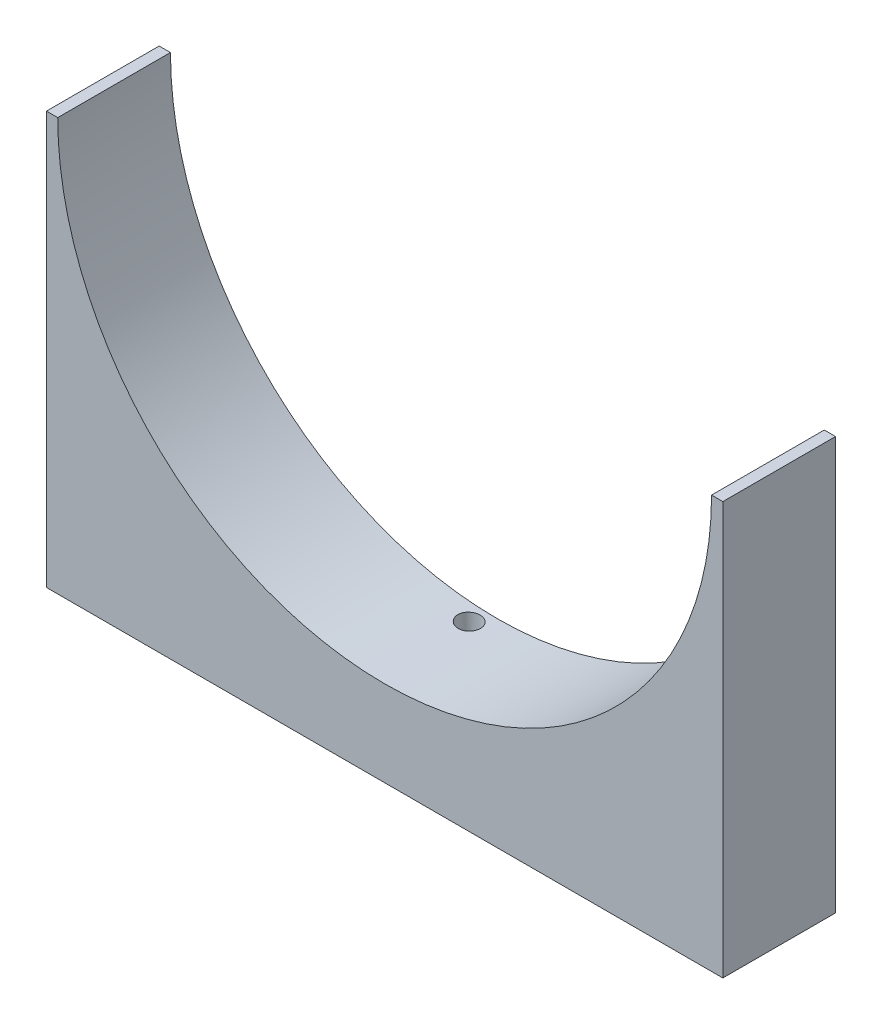
ISO-10303-21;
HEADER;
FILE_DESCRIPTION(('STEP AP214'),'2;1');
FILE_NAME('part.step','',(''),(''),'','','');
FILE_SCHEMA(('AUTOMOTIVE_DESIGN { 1 0 10303 214 1 1 1 1 }'));
ENDSEC;
DATA;
#1=APPLICATION_CONTEXT('core data for automotive mechanical design processes');
#2=APPLICATION_PROTOCOL_DEFINITION('international standard','automotive_design',2000,#1);
#3=PRODUCT_CONTEXT('',#1,'mechanical');
#4=PRODUCT('Part','Part','',(#3));
#5=PRODUCT_RELATED_PRODUCT_CATEGORY('part','',(#4));
#6=PRODUCT_DEFINITION_FORMATION('','',#4);
#7=PRODUCT_DEFINITION_CONTEXT('part definition',#1,'design');
#8=PRODUCT_DEFINITION('design','',#6,#7);
#9=PRODUCT_DEFINITION_SHAPE('','',#8);
#10=(LENGTH_UNIT() NAMED_UNIT(*) SI_UNIT(.MILLI.,.METRE.));
#11=(NAMED_UNIT(*) PLANE_ANGLE_UNIT() SI_UNIT($,.RADIAN.));
#12=(NAMED_UNIT(*) SI_UNIT($,.STERADIAN.) SOLID_ANGLE_UNIT());
#13=UNCERTAINTY_MEASURE_WITH_UNIT(LENGTH_MEASURE(1.E-05),#10,'distance_accuracy_value','');
#14=(GEOMETRIC_REPRESENTATION_CONTEXT(3) GLOBAL_UNCERTAINTY_ASSIGNED_CONTEXT((#13)) GLOBAL_UNIT_ASSIGNED_CONTEXT((#10,
#11,#12)) REPRESENTATION_CONTEXT('',''));
#15=CARTESIAN_POINT('',(0.,0.,0.));
#16=DIRECTION('',(0.,0.,1.));
#17=DIRECTION('',(1.,0.,0.));
#18=AXIS2_PLACEMENT_3D('',#15,#16,#17);
#19=CARTESIAN_POINT('',(0.,-23.241,12.7));
#20=DIRECTION('',(0.,1.,0.));
#21=DIRECTION('',(0.,0.,1.));
#22=AXIS2_PLACEMENT_3D('',#19,#20,#21);
#23=PLANE('',#22);
#24=CARTESIAN_POINT('',(-1.26999999999994,-23.241,1.90499999999989));
#25=DIRECTION('',(0.,-1.,0.));
#26=DIRECTION('',(0.,0.,-1.));
#27=AXIS2_PLACEMENT_3D('',#24,#25,#26);
#28=CIRCLE('',#27,1.26999999999999);
#29=CARTESIAN_POINT('',(-1.26999999999994,-23.241,0.6349999999999));
#30=VERTEX_POINT('',#29);
#31=EDGE_CURVE('E437',#30,#30,#28,.T.);
#32=ORIENTED_EDGE('',*,*,#31,.F.);
#33=EDGE_LOOP('',(#32));
#34=FACE_BOUND('',#33,.T.);
#35=DIRECTION('',(0.,0.,-1.));
#36=VECTOR('',#35,1.);
#37=CARTESIAN_POINT('',(9.65200000000008,-23.241,3.68299999999987));
#38=LINE('',#37,#36);
#39=CARTESIAN_POINT('',(9.65200000000008,-23.241,3.68299999999987));
#40=VERTEX_POINT('',#39);
#41=CARTESIAN_POINT('',(9.65200000000008,-23.241,0.126999999999995));
#42=VERTEX_POINT('',#41);
#43=EDGE_CURVE('E161',#40,#42,#38,.T.);
#44=ORIENTED_EDGE('',*,*,#43,.F.);
#45=DIRECTION('',(-1.,0.,0.));
#46=VECTOR('',#45,1.);
#47=CARTESIAN_POINT('',(13.2080000000001,-23.241,3.68299999999987));
#48=LINE('',#47,#46);
#49=CARTESIAN_POINT('',(13.2080000000001,-23.241,3.68299999999987));
#50=VERTEX_POINT('',#49);
#51=EDGE_CURVE('E174',#50,#40,#48,.T.);
#52=ORIENTED_EDGE('',*,*,#51,.F.);
#53=DIRECTION('',(0.,0.,1.));
#54=VECTOR('',#53,1.);
#55=CARTESIAN_POINT('',(13.2080000000001,-23.241,3.68299999999987));
#56=LINE('',#55,#54);
#57=CARTESIAN_POINT('',(13.2080000000001,-23.241,0.126999999999995));
#58=VERTEX_POINT('',#57);
#59=EDGE_CURVE('E183',#58,#50,#56,.T.);
#60=ORIENTED_EDGE('',*,*,#59,.F.);
#61=DIRECTION('',(1.,0.,0.));
#62=VECTOR('',#61,1.);
#63=CARTESIAN_POINT('',(13.2080000000001,-23.241,0.126999999999995));
#64=LINE('',#63,#62);
#65=EDGE_CURVE('E164',#42,#58,#64,.T.);
#66=ORIENTED_EDGE('',*,*,#65,.F.);
#67=EDGE_LOOP('',(#44,#52,#60,#66));
#68=FACE_BOUND('',#67,.T.);
#69=DIRECTION('',(1.,0.,0.));
#70=VECTOR('',#69,1.);
#71=CARTESIAN_POINT('',(0.,-23.241,0.));
#72=LINE('',#71,#70);
#73=CARTESIAN_POINT('',(-38.1,-23.241,0.));
#74=VERTEX_POINT('',#73);
#75=CARTESIAN_POINT('',(38.1,-23.241,0.));
#76=VERTEX_POINT('',#75);
#77=EDGE_CURVE('E223',#74,#76,#72,.T.);
#78=ORIENTED_EDGE('',*,*,#77,.T.);
#79=DIRECTION('',(0.,0.,-1.));
#80=VECTOR('',#79,1.);
#81=CARTESIAN_POINT('',(38.1,-23.241,12.7));
#82=LINE('',#81,#80);
#83=CARTESIAN_POINT('',(38.1,-23.241,12.7));
#84=VERTEX_POINT('',#83);
#85=EDGE_CURVE('E232',#84,#76,#82,.T.);
#86=ORIENTED_EDGE('',*,*,#85,.F.);
#87=DIRECTION('',(1.,0.,0.));
#88=VECTOR('',#87,1.);
#89=CARTESIAN_POINT('',(0.,-23.241,12.7));
#90=LINE('',#89,#88);
#91=CARTESIAN_POINT('',(-38.1,-23.241,12.7));
#92=VERTEX_POINT('',#91);
#93=EDGE_CURVE('E211',#92,#84,#90,.T.);
#94=ORIENTED_EDGE('',*,*,#93,.F.);
#95=DIRECTION('',(0.,0.,-1.));
#96=VECTOR('',#95,1.);
#97=CARTESIAN_POINT('',(-38.1,-23.241,12.7));
#98=LINE('',#97,#96);
#99=EDGE_CURVE('E235',#92,#74,#98,.T.);
#100=ORIENTED_EDGE('',*,*,#99,.T.);
#101=EDGE_LOOP('',(#78,#86,#94,#100));
#102=FACE_BOUND('',#101,.T.);
#103=DIRECTION('',(0.,0.,1.));
#104=VECTOR('',#103,1.);
#105=CARTESIAN_POINT('',(-12.1919999999999,-23.241,3.68299999999987));
#106=LINE('',#105,#104);
#107=CARTESIAN_POINT('',(-12.1919999999999,-23.241,0.126999999999996));
#108=VERTEX_POINT('',#107);
#109=CARTESIAN_POINT('',(-12.1919999999999,-23.241,3.68299999999987));
#110=VERTEX_POINT('',#109);
#111=EDGE_CURVE('E160',#108,#110,#106,.T.);
#112=ORIENTED_EDGE('',*,*,#111,.F.);
#113=DIRECTION('',(1.,0.,0.));
#114=VECTOR('',#113,1.);
#115=CARTESIAN_POINT('',(-15.7479999999999,-23.241,0.126999999999996));
#116=LINE('',#115,#114);
#117=CARTESIAN_POINT('',(-15.7479999999999,-23.241,0.126999999999997));
#118=VERTEX_POINT('',#117);
#119=EDGE_CURVE('E157',#118,#108,#116,.T.);
#120=ORIENTED_EDGE('',*,*,#119,.F.);
#121=DIRECTION('',(0.,0.,-1.));
#122=VECTOR('',#121,1.);
#123=CARTESIAN_POINT('',(-15.7479999999999,-23.241,3.68299999999987));
#124=LINE('',#123,#122);
#125=CARTESIAN_POINT('',(-15.7479999999999,-23.241,3.68299999999987));
#126=VERTEX_POINT('',#125);
#127=EDGE_CURVE('E60',#126,#118,#124,.T.);
#128=ORIENTED_EDGE('',*,*,#127,.F.);
#129=DIRECTION('',(-1.,0.,0.));
#130=VECTOR('',#129,1.);
#131=CARTESIAN_POINT('',(-15.7479999999999,-23.241,3.68299999999987));
#132=LINE('',#131,#130);
#133=EDGE_CURVE('E55',#110,#126,#132,.T.);
#134=ORIENTED_EDGE('',*,*,#133,.F.);
#135=EDGE_LOOP('',(#112,#120,#128,#134));
#136=FACE_BOUND('',#135,.T.);
#137=ADVANCED_FACE('F35',(#34,#68,#102,#136),#23,.F.);
#138=CARTESIAN_POINT('',(0.,23.241,12.7));
#139=DIRECTION('',(0.,0.,-1.));
#140=DIRECTION('',(-1.,0.,0.));
#141=AXIS2_PLACEMENT_3D('',#138,#139,#140);
#142=CYLINDRICAL_SURFACE('',#141,36.83);
#143=CARTESIAN_POINT('',(-1.26999999999994,-13.5670969353212,0.6349999999999));
#144=CARTESIAN_POINT('',(-1.3413984255176,-13.564633158686,0.635003162584372));
#145=CARTESIAN_POINT('',(-1.41284115198424,-13.5619582238856,0.641041142527143));
#146=CARTESIAN_POINT('',(-1.55374326678223,-13.5562793906911,0.665036783107604));
#147=CARTESIAN_POINT('',(-1.6232001587152,-13.5532750993701,0.68300881332199));
#148=CARTESIAN_POINT('',(-1.75807029287731,-13.5470774733344,0.730355204521775));
#149=CARTESIAN_POINT('',(-1.82348559208863,-13.5438842364318,0.759723708883992));
#150=CARTESIAN_POINT('',(-1.94843562919993,-13.5374776381979,0.82902211736103));
#151=CARTESIAN_POINT('',(-2.00797180218536,-13.5342642819824,0.868949435290302));
#152=CARTESIAN_POINT('',(-2.1195350580313,-13.5280032521179,0.958269192384198));
#153=CARTESIAN_POINT('',(-2.17155732839143,-13.5249556854257,1.00766765090023));
#154=CARTESIAN_POINT('',(-2.26656992034588,-13.5192207861601,1.11451928255205));
#155=CARTESIAN_POINT('',(-2.30955991832444,-13.5165334664952,1.17197274416628));
#156=CARTESIAN_POINT('',(-2.38524787598003,-13.5116996971037,1.29325836385419));
#157=CARTESIAN_POINT('',(-2.41795388411296,-13.5095528246759,1.35708548196909));
#158=CARTESIAN_POINT('',(-2.47218068614299,-13.5059449823295,1.48934433288994));
#159=CARTESIAN_POINT('',(-2.49370164395019,-13.5044840023595,1.55777599820245));
#160=CARTESIAN_POINT('',(-2.52490591688333,-13.5023530964867,1.69715231239011));
#161=CARTESIAN_POINT('',(-2.53461325557054,-13.5016815652969,1.76809155846894));
#162=CARTESIAN_POINT('',(-2.5419901763335,-13.5011719597921,1.9105957260209));
#163=CARTESIAN_POINT('',(-2.53965990073112,-13.5013338756231,1.98216064008671));
#164=CARTESIAN_POINT('',(-2.523040990318,-13.5024787666298,2.12377892141007));
#165=CARTESIAN_POINT('',(-2.50876914969717,-13.5034605887148,2.19383426981601));
#166=CARTESIAN_POINT('',(-2.46869936411633,-13.5061743584088,2.33055165121498));
#167=CARTESIAN_POINT('',(-2.44290137424829,-13.5079063089404,2.39721367098584));
#168=CARTESIAN_POINT('',(-2.38049582295823,-13.5120014178101,2.52530475233133));
#169=CARTESIAN_POINT('',(-2.34388087871516,-13.5143650071509,2.58673020280909));
#170=CARTESIAN_POINT('',(-2.26089033052961,-13.5195630772806,2.70256687806284));
#171=CARTESIAN_POINT('',(-2.21451461366033,-13.5223975635175,2.75697802167541));
#172=CARTESIAN_POINT('',(-2.1132109136816,-13.5283597065965,2.85736048870396));
#173=CARTESIAN_POINT('',(-2.05826556782119,-13.5314879533849,2.90331425540846));
#174=CARTESIAN_POINT('',(-1.94144666984391,-13.5378403964021,2.98534882051589));
#175=CARTESIAN_POINT('',(-1.87957305568251,-13.5410645934899,3.02142953049293));
#176=CARTESIAN_POINT('',(-1.75055470879424,-13.5474306638349,3.08274166337729));
#177=CARTESIAN_POINT('',(-1.68340273392403,-13.5505724158088,3.1079578612541));
#178=CARTESIAN_POINT('',(-1.54580590677088,-13.556610291675,3.14674896157567));
#179=CARTESIAN_POINT('',(-1.47536105843912,-13.5595064158622,3.16032387798869));
#180=CARTESIAN_POINT('',(-1.33319799696497,-13.5649307756871,3.17543858792182));
#181=CARTESIAN_POINT('',(-1.2614801541072,-13.5674591163989,3.17698182549117));
#182=CARTESIAN_POINT('',(-1.11879110368045,-13.5720724402006,3.16799090195806));
#183=CARTESIAN_POINT('',(-1.04781989134269,-13.5741574261238,3.15745681804176));
#184=CARTESIAN_POINT('',(-0.908726649588051,-13.577853232219,3.12462369597625));
#185=CARTESIAN_POINT('',(-0.840601437588883,-13.5794645949035,3.10233820093502));
#186=CARTESIAN_POINT('',(-0.709053165612059,-13.5822328313661,3.04663935240717));
#187=CARTESIAN_POINT('',(-0.645630086273863,-13.5833897070156,3.01322604474126));
#188=CARTESIAN_POINT('',(-0.525335443880469,-13.5853023448645,2.9362469331033));
#189=CARTESIAN_POINT('',(-0.46845921877602,-13.5860583938955,2.89268842125482));
#190=CARTESIAN_POINT('',(-0.362822312192875,-13.5872507903026,2.79664156403024));
#191=CARTESIAN_POINT('',(-0.314061634064403,-13.5876871375466,2.74415321496778));
#192=CARTESIAN_POINT('',(-0.226040466310898,-13.5883327226242,2.63173579485299));
#193=CARTESIAN_POINT('',(-0.186780084174583,-13.5885419578882,2.57180663962512));
#194=CARTESIAN_POINT('',(-0.1188746804404,-13.5888238768162,2.44620882762363));
#195=CARTESIAN_POINT('',(-0.0902296578250363,-13.5888965604931,2.38054017140015));
#196=CARTESIAN_POINT('',(-0.0443630510712326,-13.5889804744592,2.24531261196172));
#197=CARTESIAN_POINT('',(-0.0271438245827492,-13.5889916920685,2.17575290905951));
#198=CARTESIAN_POINT('',(-0.00462701011960557,-13.5890014563286,2.03472986753731));
#199=CARTESIAN_POINT('',(0.000670552020838535,-13.5890000029519,1.96326652479248));
#200=CARTESIAN_POINT('',(-0.000806438632678773,-13.5889999969226,1.82046018947111));
#201=CARTESIAN_POINT('',(-0.00758174969557745,-13.5890014444521,1.74911720473569));
#202=CARTESIAN_POINT('',(-0.0330136767490354,-13.5889873691361,1.60858115068278));
#203=CARTESIAN_POINT('',(-0.051670320864399,-13.5889718462504,1.53938808645486));
#204=CARTESIAN_POINT('',(-0.100335753968931,-13.5888713123734,1.40511493875504));
#205=CARTESIAN_POINT('',(-0.130344765506851,-13.5887863000198,1.34003493594367));
#206=CARTESIAN_POINT('',(-0.200861658239336,-13.5884690743998,1.21583949717079));
#207=CARTESIAN_POINT('',(-0.241369129335194,-13.5882368668828,1.15672382835128));
#208=CARTESIAN_POINT('',(-0.331724690748256,-13.5875336904411,1.04614205171361));
#209=CARTESIAN_POINT('',(-0.381571218137357,-13.5870627614449,0.994674666505464));
#210=CARTESIAN_POINT('',(-0.489208694691249,-13.5857900477252,0.900826887301894));
#211=CARTESIAN_POINT('',(-0.547001578379601,-13.5849881823403,0.858448712506168));
#212=CARTESIAN_POINT('',(-0.668885342186442,-13.582975965617,0.783989395772605));
#213=CARTESIAN_POINT('',(-0.732977880425444,-13.5817655065281,0.751910974344554));
#214=CARTESIAN_POINT('',(-0.865578372554791,-13.5788866588467,0.699003675041632));
#215=CARTESIAN_POINT('',(-0.934080965732984,-13.5772188184788,0.678161417465995));
#216=CARTESIAN_POINT('',(-1.04751321583745,-13.5741265237661,0.653838766319983));
#217=CARTESIAN_POINT('',(-1.09171208114275,-13.5728430695767,0.646782635996145));
#218=CARTESIAN_POINT('',(-1.18060150777471,-13.5700996533464,0.637362264176699));
#219=CARTESIAN_POINT('',(-1.22529206878554,-13.5686396914189,0.634998019667588));
#220=CARTESIAN_POINT('',(-1.26999999999994,-13.5670969353212,0.6349999999999));
#221=B_SPLINE_CURVE_WITH_KNOTS('',3,(#143,#144,#145,#146,#147,#148,#149,#150,#151,#152,#153,
#154,#155,#156,#157,#158,#159,#160,#161,#162,#163,#164,#165,#166,#167,#168,#169,#170,#171,#172,
#173,#174,#175,#176,#177,#178,#179,#180,#181,#182,#183,#184,#185,#186,#187,#188,#189,#190,#191,
#192,#193,#194,#195,#196,#197,#198,#199,#200,#201,#202,#203,#204,#205,#206,#207,#208,#209,#210,
#211,#212,#213,#214,#215,#216,#217,#218,#219,#220),.UNSPECIFIED.,.T.,.F.,(4,2,2,2,2,2,2,2,2,2,2,
2,2,2,2,2,2,2,2,2,2,2,2,2,2,2,2,2,2,2,2,2,2,2,2,2,2,2,4),(0.,0.214159332340651,
0.428576998825551,0.642884622152653,0.857139803340438,1.07153160778553,1.28593109232917,
1.50016236350018,1.71439049515385,1.92818225173314,2.14197148063782,2.35546054839125,
2.56895044794513,2.78258639725547,2.99622481835263,3.21030184968439,3.42438079828771,
3.63875877922949,3.85313650294096,4.06745285911063,4.28176784559192,4.49583637930469,
4.70990403156366,4.92381828952282,5.13773263578893,5.35164940222214,5.56556614815117,
5.77952702090476,5.99348835731056,6.2074631326013,6.42143841440264,6.63541789113514,
6.84938901050017,7.06332435288416,7.27731186989301,7.49135586176313,7.70514441005262,
7.83924578244811,7.97334706871301),.UNSPECIFIED.);
#222=CARTESIAN_POINT('',(-1.26999999999994,-13.5670969353212,0.6349999999999));
#223=VERTEX_POINT('',#222);
#224=EDGE_CURVE('E40',#223,#223,#221,.T.);
#225=ORIENTED_EDGE('',*,*,#224,.F.);
#226=EDGE_LOOP('',(#225));
#227=FACE_BOUND('',#226,.T.);
#228=CARTESIAN_POINT('',(0.,23.241,0.));
#229=DIRECTION('',(0.,0.,1.));
#230=DIRECTION('',(1.,0.,0.));
#231=AXIS2_PLACEMENT_3D('',#228,#229,#230);
#232=CIRCLE('',#231,36.83);
#233=CARTESIAN_POINT('',(-36.83,23.241,0.));
#234=VERTEX_POINT('',#233);
#235=CARTESIAN_POINT('',(36.83,23.241,0.));
#236=VERTEX_POINT('',#235);
#237=EDGE_CURVE('E199',#234,#236,#232,.T.);
#238=ORIENTED_EDGE('',*,*,#237,.F.);
#239=DIRECTION('',(0.,0.,-1.));
#240=VECTOR('',#239,1.);
#241=CARTESIAN_POINT('',(-36.83,23.241,12.7));
#242=LINE('',#241,#240);
#243=CARTESIAN_POINT('',(-36.83,23.241,12.7));
#244=VERTEX_POINT('',#243);
#245=EDGE_CURVE('E11',#244,#234,#242,.T.);
#246=ORIENTED_EDGE('',*,*,#245,.F.);
#247=CARTESIAN_POINT('',(0.,23.241,12.7));
#248=DIRECTION('',(0.,0.,1.));
#249=DIRECTION('',(1.,0.,0.));
#250=AXIS2_PLACEMENT_3D('',#247,#248,#249);
#251=CIRCLE('',#250,36.83);
#252=CARTESIAN_POINT('',(36.83,23.241,12.7));
#253=VERTEX_POINT('',#252);
#254=EDGE_CURVE('E200',#244,#253,#251,.T.);
#255=ORIENTED_EDGE('',*,*,#254,.T.);
#256=DIRECTION('',(0.,0.,-1.));
#257=VECTOR('',#256,1.);
#258=CARTESIAN_POINT('',(36.83,23.241,12.7));
#259=LINE('',#258,#257);
#260=EDGE_CURVE('E228',#253,#236,#259,.T.);
#261=ORIENTED_EDGE('',*,*,#260,.T.);
#262=EDGE_LOOP('',(#238,#246,#255,#261));
#263=FACE_BOUND('',#262,.T.);
#264=ADVANCED_FACE('F37',(#227,#263),#142,.F.);
#265=CARTESIAN_POINT('',(0.,23.241,12.7));
#266=DIRECTION('',(0.,1.,0.));
#267=DIRECTION('',(0.,0.,1.));
#268=AXIS2_PLACEMENT_3D('',#265,#266,#267);
#269=PLANE('',#268);
#270=DIRECTION('',(1.,0.,0.));
#271=VECTOR('',#270,1.);
#272=CARTESIAN_POINT('',(0.,23.241,0.));
#273=LINE('',#272,#271);
#274=CARTESIAN_POINT('',(-38.1,23.241,0.));
#275=VERTEX_POINT('',#274);
#276=EDGE_CURVE('E217',#275,#234,#273,.T.);
#277=ORIENTED_EDGE('',*,*,#276,.F.);
#278=DIRECTION('',(0.,0.,-1.));
#279=VECTOR('',#278,1.);
#280=CARTESIAN_POINT('',(-38.1,23.241,12.7));
#281=LINE('',#280,#279);
#282=CARTESIAN_POINT('',(-38.1,23.241,12.7));
#283=VERTEX_POINT('',#282);
#284=EDGE_CURVE('E48',#283,#275,#281,.T.);
#285=ORIENTED_EDGE('',*,*,#284,.F.);
#286=DIRECTION('',(1.,0.,0.));
#287=VECTOR('',#286,1.);
#288=CARTESIAN_POINT('',(0.,23.241,12.7));
#289=LINE('',#288,#287);
#290=EDGE_CURVE('E203',#283,#244,#289,.T.);
#291=ORIENTED_EDGE('',*,*,#290,.T.);
#292=ORIENTED_EDGE('',*,*,#245,.T.);
#293=EDGE_LOOP('',(#277,#285,#291,#292));
#294=FACE_BOUND('',#293,.T.);
#295=ADVANCED_FACE('F244',(#294),#269,.T.);
#296=CARTESIAN_POINT('',(-38.1,0.,12.7));
#297=DIRECTION('',(-1.,0.,0.));
#298=DIRECTION('',(0.,0.,1.));
#299=AXIS2_PLACEMENT_3D('',#296,#297,#298);
#300=PLANE('',#299);
#301=DIRECTION('',(0.,1.,0.));
#302=VECTOR('',#301,1.);
#303=CARTESIAN_POINT('',(-38.1,0.,0.));
#304=LINE('',#303,#302);
#305=EDGE_CURVE('E220',#74,#275,#304,.T.);
#306=ORIENTED_EDGE('',*,*,#305,.F.);
#307=ORIENTED_EDGE('',*,*,#99,.F.);
#308=DIRECTION('',(0.,1.,0.));
#309=VECTOR('',#308,1.);
#310=CARTESIAN_POINT('',(-38.1,0.,12.7));
#311=LINE('',#310,#309);
#312=EDGE_CURVE('E207',#92,#283,#311,.T.);
#313=ORIENTED_EDGE('',*,*,#312,.T.);
#314=ORIENTED_EDGE('',*,*,#284,.T.);
#315=EDGE_LOOP('',(#306,#307,#313,#314));
#316=FACE_BOUND('',#315,.T.);
#317=ADVANCED_FACE('F240',(#316),#300,.T.);
#318=CARTESIAN_POINT('',(38.1,0.,12.7));
#319=DIRECTION('',(-1.,0.,0.));
#320=DIRECTION('',(0.,0.,1.));
#321=AXIS2_PLACEMENT_3D('',#318,#319,#320);
#322=PLANE('',#321);
#323=DIRECTION('',(0.,1.,0.));
#324=VECTOR('',#323,1.);
#325=CARTESIAN_POINT('',(38.1,0.,0.));
#326=LINE('',#325,#324);
#327=CARTESIAN_POINT('',(38.1,23.241,0.));
#328=VERTEX_POINT('',#327);
#329=EDGE_CURVE('E225',#76,#328,#326,.T.);
#330=ORIENTED_EDGE('',*,*,#329,.T.);
#331=DIRECTION('',(0.,0.,-1.));
#332=VECTOR('',#331,1.);
#333=CARTESIAN_POINT('',(38.1,23.241,12.7));
#334=LINE('',#333,#332);
#335=CARTESIAN_POINT('',(38.1,23.241,12.7));
#336=VERTEX_POINT('',#335);
#337=EDGE_CURVE('E230',#336,#328,#334,.T.);
#338=ORIENTED_EDGE('',*,*,#337,.F.);
#339=DIRECTION('',(0.,1.,0.));
#340=VECTOR('',#339,1.);
#341=CARTESIAN_POINT('',(38.1,0.,12.7));
#342=LINE('',#341,#340);
#343=EDGE_CURVE('E213',#84,#336,#342,.T.);
#344=ORIENTED_EDGE('',*,*,#343,.F.);
#345=ORIENTED_EDGE('',*,*,#85,.T.);
#346=EDGE_LOOP('',(#330,#338,#344,#345));
#347=FACE_BOUND('',#346,.T.);
#348=ADVANCED_FACE('F256',(#347),#322,.F.);
#349=EDGE_CURVE('E204',#236,#328,#273,.T.);
#350=ORIENTED_EDGE('',*,*,#349,.F.);
#351=ORIENTED_EDGE('',*,*,#260,.F.);
#352=EDGE_CURVE('E208',#253,#336,#289,.T.);
#353=ORIENTED_EDGE('',*,*,#352,.T.);
#354=ORIENTED_EDGE('',*,*,#337,.T.);
#355=EDGE_LOOP('',(#350,#351,#353,#354));
#356=FACE_BOUND('',#355,.T.);
#357=ADVANCED_FACE('F266',(#356),#269,.T.);
#358=CARTESIAN_POINT('',(0.,0.,12.7));
#359=DIRECTION('',(0.,0.,1.));
#360=DIRECTION('',(1.,0.,0.));
#361=AXIS2_PLACEMENT_3D('',#358,#359,#360);
#362=PLANE('',#361);
#363=ORIENTED_EDGE('',*,*,#254,.F.);
#364=ORIENTED_EDGE('',*,*,#290,.F.);
#365=ORIENTED_EDGE('',*,*,#312,.F.);
#366=ORIENTED_EDGE('',*,*,#93,.T.);
#367=ORIENTED_EDGE('',*,*,#343,.T.);
#368=ORIENTED_EDGE('',*,*,#352,.F.);
#369=EDGE_LOOP('',(#363,#364,#365,#366,#367,#368));
#370=FACE_BOUND('',#369,.T.);
#371=ADVANCED_FACE('F262',(#370),#362,.T.);
#372=CARTESIAN_POINT('',(0.,0.,0.));
#373=DIRECTION('',(0.,0.,1.));
#374=DIRECTION('',(1.,0.,0.));
#375=AXIS2_PLACEMENT_3D('',#372,#373,#374);
#376=PLANE('',#375);
#377=ORIENTED_EDGE('',*,*,#237,.T.);
#378=ORIENTED_EDGE('',*,*,#349,.T.);
#379=ORIENTED_EDGE('',*,*,#329,.F.);
#380=ORIENTED_EDGE('',*,*,#77,.F.);
#381=ORIENTED_EDGE('',*,*,#305,.T.);
#382=ORIENTED_EDGE('',*,*,#276,.T.);
#383=EDGE_LOOP('',(#377,#378,#379,#380,#381,#382));
#384=FACE_BOUND('',#383,.T.);
#385=ADVANCED_FACE('F248',(#384),#376,.F.);
#386=CARTESIAN_POINT('',(9.65200000000008,-25.781,3.68299999999987));
#387=DIRECTION('',(1.,0.,0.));
#388=DIRECTION('',(0.,0.,-1.));
#389=AXIS2_PLACEMENT_3D('',#386,#387,#388);
#390=PLANE('',#389);
#391=ORIENTED_EDGE('',*,*,#43,.T.);
#392=DIRECTION('',(0.,1.,0.));
#393=VECTOR('',#392,1.);
#394=CARTESIAN_POINT('',(9.65200000000008,-25.781,0.126999999999995));
#395=LINE('',#394,#393);
#396=CARTESIAN_POINT('',(9.65200000000008,-25.781,0.126999999999995));
#397=VERTEX_POINT('',#396);
#398=EDGE_CURVE('E196',#397,#42,#395,.T.);
#399=ORIENTED_EDGE('',*,*,#398,.F.);
#400=DIRECTION('',(0.,0.,-1.));
#401=VECTOR('',#400,1.);
#402=CARTESIAN_POINT('',(9.65200000000008,-25.781,3.68299999999987));
#403=LINE('',#402,#401);
#404=CARTESIAN_POINT('',(9.65200000000008,-25.781,3.68299999999987));
#405=VERTEX_POINT('',#404);
#406=EDGE_CURVE('E170',#405,#397,#403,.T.);
#407=ORIENTED_EDGE('',*,*,#406,.F.);
#408=DIRECTION('',(0.,1.,0.));
#409=VECTOR('',#408,1.);
#410=CARTESIAN_POINT('',(9.65200000000008,-25.781,3.68299999999987));
#411=LINE('',#410,#409);
#412=EDGE_CURVE('E179',#405,#40,#411,.T.);
#413=ORIENTED_EDGE('',*,*,#412,.T.);
#414=EDGE_LOOP('',(#391,#399,#407,#413));
#415=FACE_BOUND('',#414,.T.);
#416=ADVANCED_FACE('F316',(#415),#390,.F.);
#417=CARTESIAN_POINT('',(13.2080000000001,-25.781,0.126999999999995));
#418=DIRECTION('',(0.,0.,1.));
#419=DIRECTION('',(1.,0.,0.));
#420=AXIS2_PLACEMENT_3D('',#417,#418,#419);
#421=PLANE('',#420);
#422=ORIENTED_EDGE('',*,*,#65,.T.);
#423=DIRECTION('',(0.,1.,0.));
#424=VECTOR('',#423,1.);
#425=CARTESIAN_POINT('',(13.2080000000001,-25.781,0.126999999999995));
#426=LINE('',#425,#424);
#427=CARTESIAN_POINT('',(13.2080000000001,-25.781,0.126999999999995));
#428=VERTEX_POINT('',#427);
#429=EDGE_CURVE('E193',#428,#58,#426,.T.);
#430=ORIENTED_EDGE('',*,*,#429,.F.);
#431=DIRECTION('',(1.,0.,0.));
#432=VECTOR('',#431,1.);
#433=CARTESIAN_POINT('',(13.2080000000001,-25.781,0.126999999999995));
#434=LINE('',#433,#432);
#435=EDGE_CURVE('E173',#397,#428,#434,.T.);
#436=ORIENTED_EDGE('',*,*,#435,.F.);
#437=ORIENTED_EDGE('',*,*,#398,.T.);
#438=EDGE_LOOP('',(#422,#430,#436,#437));
#439=FACE_BOUND('',#438,.T.);
#440=ADVANCED_FACE('F325',(#439),#421,.F.);
#441=CARTESIAN_POINT('',(13.2080000000001,-25.781,3.68299999999987));
#442=DIRECTION('',(-1.,0.,0.));
#443=DIRECTION('',(0.,0.,1.));
#444=AXIS2_PLACEMENT_3D('',#441,#442,#443);
#445=PLANE('',#444);
#446=ORIENTED_EDGE('',*,*,#59,.T.);
#447=DIRECTION('',(0.,1.,0.));
#448=VECTOR('',#447,1.);
#449=CARTESIAN_POINT('',(13.2080000000001,-25.781,3.68299999999987));
#450=LINE('',#449,#448);
#451=CARTESIAN_POINT('',(13.2080000000001,-25.781,3.68299999999987));
#452=VERTEX_POINT('',#451);
#453=EDGE_CURVE('E190',#452,#50,#450,.T.);
#454=ORIENTED_EDGE('',*,*,#453,.F.);
#455=DIRECTION('',(0.,0.,1.));
#456=VECTOR('',#455,1.);
#457=CARTESIAN_POINT('',(13.2080000000001,-25.781,3.68299999999987));
#458=LINE('',#457,#456);
#459=EDGE_CURVE('E176',#428,#452,#458,.T.);
#460=ORIENTED_EDGE('',*,*,#459,.F.);
#461=ORIENTED_EDGE('',*,*,#429,.T.);
#462=EDGE_LOOP('',(#446,#454,#460,#461));
#463=FACE_BOUND('',#462,.T.);
#464=ADVANCED_FACE('F335',(#463),#445,.F.);
#465=CARTESIAN_POINT('',(13.2080000000001,-25.781,3.68299999999987));
#466=DIRECTION('',(0.,0.,-1.));
#467=DIRECTION('',(-1.,0.,0.));
#468=AXIS2_PLACEMENT_3D('',#465,#466,#467);
#469=PLANE('',#468);
#470=ORIENTED_EDGE('',*,*,#51,.T.);
#471=ORIENTED_EDGE('',*,*,#412,.F.);
#472=DIRECTION('',(-1.,0.,0.));
#473=VECTOR('',#472,1.);
#474=CARTESIAN_POINT('',(13.2080000000001,-25.781,3.68299999999987));
#475=LINE('',#474,#473);
#476=EDGE_CURVE('E178',#452,#405,#475,.T.);
#477=ORIENTED_EDGE('',*,*,#476,.F.);
#478=ORIENTED_EDGE('',*,*,#453,.T.);
#479=EDGE_LOOP('',(#470,#471,#477,#478));
#480=FACE_BOUND('',#479,.T.);
#481=ADVANCED_FACE('F345',(#480),#469,.F.);
#482=CARTESIAN_POINT('',(0.,-25.781,0.));
#483=DIRECTION('',(0.,1.,0.));
#484=DIRECTION('',(0.,0.,1.));
#485=AXIS2_PLACEMENT_3D('',#482,#483,#484);
#486=PLANE('',#485);
#487=ORIENTED_EDGE('',*,*,#406,.T.);
#488=ORIENTED_EDGE('',*,*,#435,.T.);
#489=ORIENTED_EDGE('',*,*,#459,.T.);
#490=ORIENTED_EDGE('',*,*,#476,.T.);
#491=EDGE_LOOP('',(#487,#488,#489,#490));
#492=FACE_BOUND('',#491,.T.);
#493=ADVANCED_FACE('F355',(#492),#486,.F.);
#494=CARTESIAN_POINT('',(-12.1919999999999,-25.781,3.68299999999987));
#495=DIRECTION('',(-1.,0.,0.));
#496=DIRECTION('',(0.,0.,1.));
#497=AXIS2_PLACEMENT_3D('',#494,#495,#496);
#498=PLANE('',#497);
#499=ORIENTED_EDGE('',*,*,#111,.T.);
#500=DIRECTION('',(0.,1.,0.));
#501=VECTOR('',#500,1.);
#502=CARTESIAN_POINT('',(-12.1919999999999,-25.781,3.68299999999987));
#503=LINE('',#502,#501);
#504=CARTESIAN_POINT('',(-12.1919999999999,-25.781,3.68299999999987));
#505=VERTEX_POINT('',#504);
#506=EDGE_CURVE('E141',#505,#110,#503,.T.);
#507=ORIENTED_EDGE('',*,*,#506,.F.);
#508=DIRECTION('',(0.,0.,1.));
#509=VECTOR('',#508,1.);
#510=CARTESIAN_POINT('',(-12.1919999999999,-25.781,3.68299999999987));
#511=LINE('',#510,#509);
#512=CARTESIAN_POINT('',(-12.1919999999999,-25.781,0.126999999999996));
#513=VERTEX_POINT('',#512);
#514=EDGE_CURVE('E148',#513,#505,#511,.T.);
#515=ORIENTED_EDGE('',*,*,#514,.F.);
#516=DIRECTION('',(0.,1.,0.));
#517=VECTOR('',#516,1.);
#518=CARTESIAN_POINT('',(-12.1919999999999,-25.781,0.126999999999996));
#519=LINE('',#518,#517);
#520=EDGE_CURVE('E442',#513,#108,#519,.T.);
#521=ORIENTED_EDGE('',*,*,#520,.T.);
#522=EDGE_LOOP('',(#499,#507,#515,#521));
#523=FACE_BOUND('',#522,.T.);
#524=ADVANCED_FACE('F159',(#523),#498,.F.);
#525=CARTESIAN_POINT('',(-15.7479999999999,-25.781,3.68299999999987));
#526=DIRECTION('',(0.,0.,-1.));
#527=DIRECTION('',(-1.,0.,0.));
#528=AXIS2_PLACEMENT_3D('',#525,#526,#527);
#529=PLANE('',#528);
#530=ORIENTED_EDGE('',*,*,#133,.T.);
#531=DIRECTION('',(0.,1.,0.));
#532=VECTOR('',#531,1.);
#533=CARTESIAN_POINT('',(-15.7479999999999,-25.781,3.68299999999987));
#534=LINE('',#533,#532);
#535=CARTESIAN_POINT('',(-15.7479999999999,-25.781,3.68299999999987));
#536=VERTEX_POINT('',#535);
#537=EDGE_CURVE('E144',#536,#126,#534,.T.);
#538=ORIENTED_EDGE('',*,*,#537,.F.);
#539=DIRECTION('',(-1.,0.,0.));
#540=VECTOR('',#539,1.);
#541=CARTESIAN_POINT('',(-15.7479999999999,-25.781,3.68299999999987));
#542=LINE('',#541,#540);
#543=EDGE_CURVE('E137',#505,#536,#542,.T.);
#544=ORIENTED_EDGE('',*,*,#543,.F.);
#545=ORIENTED_EDGE('',*,*,#506,.T.);
#546=EDGE_LOOP('',(#530,#538,#544,#545));
#547=FACE_BOUND('',#546,.T.);
#548=ADVANCED_FACE('F139',(#547),#529,.F.);
#549=CARTESIAN_POINT('',(-15.7479999999999,-25.781,3.68299999999987));
#550=DIRECTION('',(1.,0.,0.));
#551=DIRECTION('',(0.,0.,-1.));
#552=AXIS2_PLACEMENT_3D('',#549,#550,#551);
#553=PLANE('',#552);
#554=ORIENTED_EDGE('',*,*,#127,.T.);
#555=DIRECTION('',(0.,1.,0.));
#556=VECTOR('',#555,1.);
#557=CARTESIAN_POINT('',(-15.7479999999999,-25.781,0.126999999999996));
#558=LINE('',#557,#556);
#559=CARTESIAN_POINT('',(-15.7479999999999,-25.781,0.126999999999996));
#560=VERTEX_POINT('',#559);
#561=EDGE_CURVE('E166',#560,#118,#558,.T.);
#562=ORIENTED_EDGE('',*,*,#561,.F.);
#563=DIRECTION('',(0.,0.,-1.));
#564=VECTOR('',#563,1.);
#565=CARTESIAN_POINT('',(-15.7479999999999,-25.781,3.68299999999987));
#566=LINE('',#565,#564);
#567=EDGE_CURVE('E147',#536,#560,#566,.T.);
#568=ORIENTED_EDGE('',*,*,#567,.F.);
#569=ORIENTED_EDGE('',*,*,#537,.T.);
#570=EDGE_LOOP('',(#554,#562,#568,#569));
#571=FACE_BOUND('',#570,.T.);
#572=ADVANCED_FACE('F382',(#571),#553,.F.);
#573=CARTESIAN_POINT('',(-15.7479999999999,-25.781,0.126999999999996));
#574=DIRECTION('',(0.,0.,1.));
#575=DIRECTION('',(1.,0.,0.));
#576=AXIS2_PLACEMENT_3D('',#573,#574,#575);
#577=PLANE('',#576);
#578=ORIENTED_EDGE('',*,*,#119,.T.);
#579=ORIENTED_EDGE('',*,*,#520,.F.);
#580=DIRECTION('',(1.,0.,0.));
#581=VECTOR('',#580,1.);
#582=CARTESIAN_POINT('',(-15.7479999999999,-25.781,0.126999999999996));
#583=LINE('',#582,#581);
#584=EDGE_CURVE('E153',#560,#513,#583,.T.);
#585=ORIENTED_EDGE('',*,*,#584,.F.);
#586=ORIENTED_EDGE('',*,*,#561,.T.);
#587=EDGE_LOOP('',(#578,#579,#585,#586));
#588=FACE_BOUND('',#587,.T.);
#589=ADVANCED_FACE('F391',(#588),#577,.F.);
#590=CARTESIAN_POINT('',(0.,-25.781,0.));
#591=DIRECTION('',(0.,-1.,0.));
#592=DIRECTION('',(0.,0.,-1.));
#593=AXIS2_PLACEMENT_3D('',#590,#591,#592);
#594=PLANE('',#593);
#595=ORIENTED_EDGE('',*,*,#514,.T.);
#596=ORIENTED_EDGE('',*,*,#543,.T.);
#597=ORIENTED_EDGE('',*,*,#567,.T.);
#598=ORIENTED_EDGE('',*,*,#584,.T.);
#599=EDGE_LOOP('',(#595,#596,#597,#598));
#600=FACE_BOUND('',#599,.T.);
#601=ADVANCED_FACE('F151',(#600),#594,.T.);
#602=CARTESIAN_POINT('',(-1.26999999999994,-8.255,1.90499999999989));
#603=DIRECTION('',(0.,-1.,0.));
#604=DIRECTION('',(0.,0.,-1.));
#605=AXIS2_PLACEMENT_3D('',#602,#603,#604);
#606=CYLINDRICAL_SURFACE('',#605,1.26999999999999);
#607=ORIENTED_EDGE('',*,*,#224,.T.);
#608=EDGE_LOOP('',(#607));
#609=FACE_BOUND('',#608,.T.);
#610=ORIENTED_EDGE('',*,*,#31,.T.);
#611=EDGE_LOOP('',(#610));
#612=FACE_BOUND('',#611,.T.);
#613=ADVANCED_FACE('F408',(#609,#612),#606,.F.);
#614=CLOSED_SHELL('',(#137,#264,#295,#317,#348,#357,#371,#385,#416,#440,#464,#481,#493,#524,
#548,#572,#589,#601,#613));
#615=MANIFOLD_SOLID_BREP('B2',#614);
#616=ADVANCED_BREP_SHAPE_REPRESENTATION('',(#18,#615),#14);
#617=SHAPE_DEFINITION_REPRESENTATION(#9,#616);
ENDSEC;
END-ISO-10303-21;
